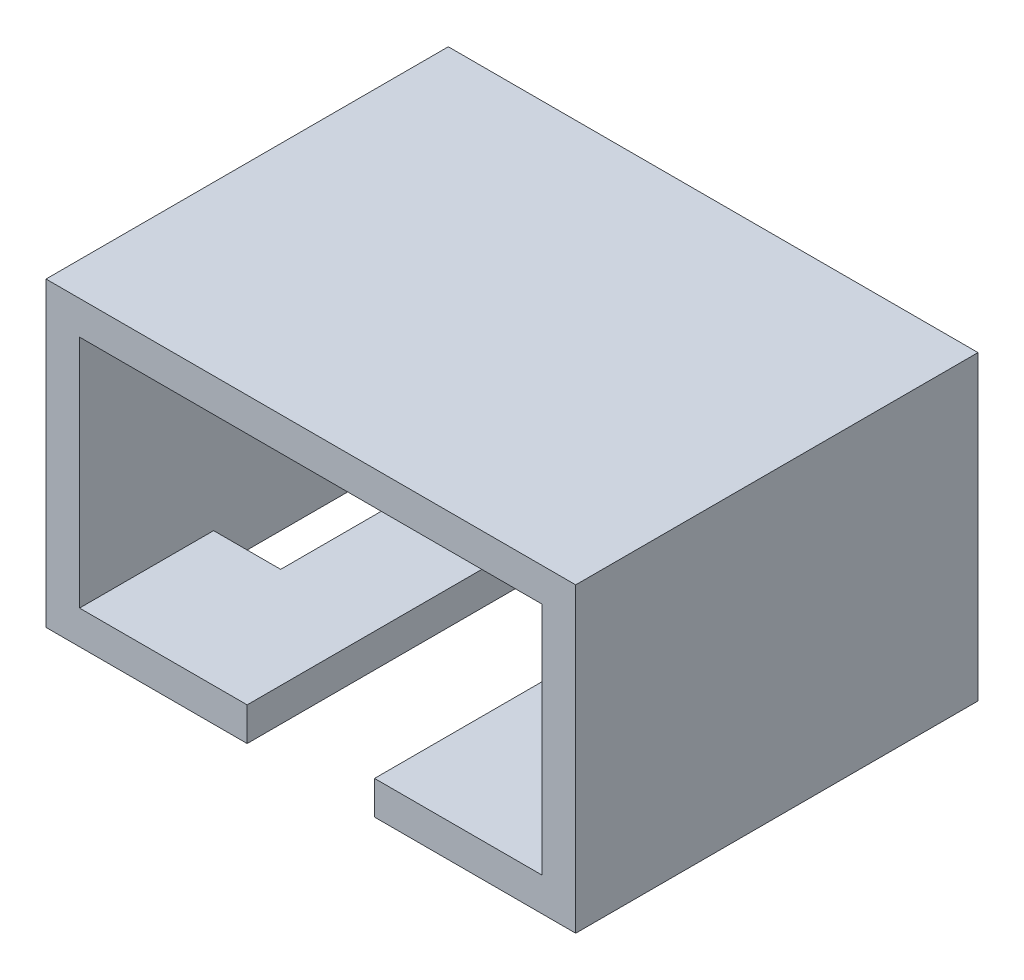
ISO-10303-21;
HEADER;
FILE_DESCRIPTION(('STEP AP214'),'2;1');
FILE_NAME('part.step','',(''),(''),'','','');
FILE_SCHEMA(('AUTOMOTIVE_DESIGN { 1 0 10303 214 1 1 1 1 }'));
ENDSEC;
DATA;
#1=APPLICATION_CONTEXT('core data for automotive mechanical design processes');
#2=APPLICATION_PROTOCOL_DEFINITION('international standard','automotive_design',2000,#1);
#3=PRODUCT_CONTEXT('',#1,'mechanical');
#4=PRODUCT('Part','Part','',(#3));
#5=PRODUCT_RELATED_PRODUCT_CATEGORY('part','',(#4));
#6=PRODUCT_DEFINITION_FORMATION('','',#4);
#7=PRODUCT_DEFINITION_CONTEXT('part definition',#1,'design');
#8=PRODUCT_DEFINITION('design','',#6,#7);
#9=PRODUCT_DEFINITION_SHAPE('','',#8);
#10=(LENGTH_UNIT() NAMED_UNIT(*) SI_UNIT(.MILLI.,.METRE.));
#11=(NAMED_UNIT(*) PLANE_ANGLE_UNIT() SI_UNIT($,.RADIAN.));
#12=(NAMED_UNIT(*) SI_UNIT($,.STERADIAN.) SOLID_ANGLE_UNIT());
#13=UNCERTAINTY_MEASURE_WITH_UNIT(LENGTH_MEASURE(1.E-05),#10,'distance_accuracy_value','');
#14=(GEOMETRIC_REPRESENTATION_CONTEXT(3) GLOBAL_UNCERTAINTY_ASSIGNED_CONTEXT((#13)) GLOBAL_UNIT_ASSIGNED_CONTEXT((#10,
#11,#12)) REPRESENTATION_CONTEXT('',''));
#15=CARTESIAN_POINT('',(0.,0.,0.));
#16=DIRECTION('',(0.,0.,1.));
#17=DIRECTION('',(1.,0.,0.));
#18=AXIS2_PLACEMENT_3D('',#15,#16,#17);
#19=CARTESIAN_POINT('',(1.75,0.,1.602));
#20=DIRECTION('',(-1.,0.,0.));
#21=DIRECTION('',(0.,-1.,0.));
#22=AXIS2_PLACEMENT_3D('',#19,#20,#21);
#23=PLANE('',#22);
#24=DIRECTION('',(0.,-1.,0.));
#25=VECTOR('',#24,1.);
#26=CARTESIAN_POINT('',(1.75,0.,0.));
#27=LINE('',#26,#25);
#28=CARTESIAN_POINT('',(1.75,0.25,0.));
#29=VERTEX_POINT('',#28);
#30=CARTESIAN_POINT('',(1.75,-0.25,0.));
#31=VERTEX_POINT('',#30);
#32=EDGE_CURVE('E228',#29,#31,#27,.T.);
#33=ORIENTED_EDGE('',*,*,#32,.F.);
#34=DIRECTION('',(0.,0.,1.));
#35=VECTOR('',#34,1.);
#36=CARTESIAN_POINT('',(1.75,0.25,1.602));
#37=LINE('',#36,#35);
#38=CARTESIAN_POINT('',(1.75,0.25,1.6));
#39=VERTEX_POINT('',#38);
#40=EDGE_CURVE('E233',#39,#29,#37,.F.);
#41=ORIENTED_EDGE('',*,*,#40,.F.);
#42=DIRECTION('',(0.,-1.,0.));
#43=VECTOR('',#42,1.);
#44=CARTESIAN_POINT('',(1.75,0.,1.6));
#45=LINE('',#44,#43);
#46=CARTESIAN_POINT('',(1.75,-0.25,1.6));
#47=VERTEX_POINT('',#46);
#48=EDGE_CURVE('E19',#47,#39,#45,.F.);
#49=ORIENTED_EDGE('',*,*,#48,.F.);
#50=DIRECTION('',(0.,0.,1.));
#51=VECTOR('',#50,1.);
#52=CARTESIAN_POINT('',(1.75,-0.25,1.602));
#53=LINE('',#52,#51);
#54=EDGE_CURVE('E236',#47,#31,#53,.F.);
#55=ORIENTED_EDGE('',*,*,#54,.T.);
#56=EDGE_LOOP('',(#33,#41,#49,#55));
#57=FACE_BOUND('',#56,.T.);
#58=ADVANCED_FACE('F16',(#57),#23,.F.);
#59=CARTESIAN_POINT('',(-0.25,0.,1.602));
#60=DIRECTION('',(-1.,0.,0.));
#61=DIRECTION('',(0.,-1.,0.));
#62=AXIS2_PLACEMENT_3D('',#59,#60,#61);
#63=PLANE('',#62);
#64=DIRECTION('',(0.,-1.,0.));
#65=VECTOR('',#64,1.);
#66=CARTESIAN_POINT('',(-0.25,0.,0.));
#67=LINE('',#66,#65);
#68=CARTESIAN_POINT('',(-0.25,0.25,0.));
#69=VERTEX_POINT('',#68);
#70=CARTESIAN_POINT('',(-0.25,-0.25,0.));
#71=VERTEX_POINT('',#70);
#72=EDGE_CURVE('E258',#69,#71,#67,.T.);
#73=ORIENTED_EDGE('',*,*,#72,.F.);
#74=DIRECTION('',(0.,0.,1.));
#75=VECTOR('',#74,1.);
#76=CARTESIAN_POINT('',(-0.25,0.25,1.602));
#77=LINE('',#76,#75);
#78=CARTESIAN_POINT('',(-0.25,0.25,1.6));
#79=VERTEX_POINT('',#78);
#80=EDGE_CURVE('E274',#79,#69,#77,.F.);
#81=ORIENTED_EDGE('',*,*,#80,.F.);
#82=DIRECTION('',(0.,-1.,0.));
#83=VECTOR('',#82,1.);
#84=CARTESIAN_POINT('',(-0.25,0.,1.6));
#85=LINE('',#84,#83);
#86=CARTESIAN_POINT('',(-0.25,-0.25,1.6));
#87=VERTEX_POINT('',#86);
#88=EDGE_CURVE('E238',#87,#79,#85,.F.);
#89=ORIENTED_EDGE('',*,*,#88,.F.);
#90=DIRECTION('',(0.,0.,1.));
#91=VECTOR('',#90,1.);
#92=CARTESIAN_POINT('',(-0.25,-0.25,1.602));
#93=LINE('',#92,#91);
#94=EDGE_CURVE('E306',#87,#71,#93,.F.);
#95=ORIENTED_EDGE('',*,*,#94,.T.);
#96=EDGE_LOOP('',(#73,#81,#89,#95));
#97=FACE_BOUND('',#96,.T.);
#98=ADVANCED_FACE('F275',(#97),#63,.F.);
#99=CARTESIAN_POINT('',(-2.25,0.,1.602));
#100=DIRECTION('',(-1.,0.,0.));
#101=DIRECTION('',(0.,-1.,0.));
#102=AXIS2_PLACEMENT_3D('',#99,#100,#101);
#103=PLANE('',#102);
#104=DIRECTION('',(0.,-1.,0.));
#105=VECTOR('',#104,1.);
#106=CARTESIAN_POINT('',(-2.25,0.,0.));
#107=LINE('',#106,#105);
#108=CARTESIAN_POINT('',(-2.25,0.25,0.));
#109=VERTEX_POINT('',#108);
#110=CARTESIAN_POINT('',(-2.25,-0.25,0.));
#111=VERTEX_POINT('',#110);
#112=EDGE_CURVE('E251',#109,#111,#107,.T.);
#113=ORIENTED_EDGE('',*,*,#112,.F.);
#114=DIRECTION('',(0.,0.,1.));
#115=VECTOR('',#114,1.);
#116=CARTESIAN_POINT('',(-2.25,0.25,1.602));
#117=LINE('',#116,#115);
#118=CARTESIAN_POINT('',(-2.25,0.25,1.6));
#119=VERTEX_POINT('',#118);
#120=EDGE_CURVE('E301',#119,#109,#117,.F.);
#121=ORIENTED_EDGE('',*,*,#120,.F.);
#122=DIRECTION('',(0.,-1.,0.));
#123=VECTOR('',#122,1.);
#124=CARTESIAN_POINT('',(-2.25,0.,1.6));
#125=LINE('',#124,#123);
#126=CARTESIAN_POINT('',(-2.25,-0.25,1.6));
#127=VERTEX_POINT('',#126);
#128=EDGE_CURVE('E253',#127,#119,#125,.F.);
#129=ORIENTED_EDGE('',*,*,#128,.F.);
#130=DIRECTION('',(0.,0.,1.));
#131=VECTOR('',#130,1.);
#132=CARTESIAN_POINT('',(-2.25,-0.25,1.602));
#133=LINE('',#132,#131);
#134=EDGE_CURVE('E296',#127,#111,#133,.F.);
#135=ORIENTED_EDGE('',*,*,#134,.T.);
#136=EDGE_LOOP('',(#113,#121,#129,#135));
#137=FACE_BOUND('',#136,.T.);
#138=ADVANCED_FACE('F647',(#137),#103,.F.);
#139=CARTESIAN_POINT('',(2.,0.25,1.602));
#140=DIRECTION('',(0.,-1.,0.));
#141=DIRECTION('',(1.,0.,0.));
#142=AXIS2_PLACEMENT_3D('',#139,#140,#141);
#143=PLANE('',#142);
#144=DIRECTION('',(1.,0.,0.));
#145=VECTOR('',#144,1.);
#146=CARTESIAN_POINT('',(2.,0.25,0.));
#147=LINE('',#146,#145);
#148=CARTESIAN_POINT('',(2.25,0.25,0.));
#149=VERTEX_POINT('',#148);
#150=EDGE_CURVE('E240',#29,#149,#147,.T.);
#151=ORIENTED_EDGE('',*,*,#150,.T.);
#152=DIRECTION('',(0.,0.,1.));
#153=VECTOR('',#152,1.);
#154=CARTESIAN_POINT('',(2.25,0.25,1.602));
#155=LINE('',#154,#153);
#156=CARTESIAN_POINT('',(2.25,0.25,1.6));
#157=VERTEX_POINT('',#156);
#158=EDGE_CURVE('E320',#157,#149,#155,.F.);
#159=ORIENTED_EDGE('',*,*,#158,.F.);
#160=DIRECTION('',(1.,0.,0.));
#161=VECTOR('',#160,1.);
#162=CARTESIAN_POINT('',(0.,0.25,1.6));
#163=LINE('',#162,#161);
#164=EDGE_CURVE('E250',#39,#157,#163,.T.);
#165=ORIENTED_EDGE('',*,*,#164,.F.);
#166=ORIENTED_EDGE('',*,*,#40,.T.);
#167=EDGE_LOOP('',(#151,#159,#165,#166));
#168=FACE_BOUND('',#167,.T.);
#169=ADVANCED_FACE('F249',(#168),#143,.T.);
#170=CARTESIAN_POINT('',(2.,-0.25,1.602));
#171=DIRECTION('',(0.,-1.,0.));
#172=DIRECTION('',(1.,0.,0.));
#173=AXIS2_PLACEMENT_3D('',#170,#171,#172);
#174=PLANE('',#173);
#175=DIRECTION('',(1.,0.,0.));
#176=VECTOR('',#175,1.);
#177=CARTESIAN_POINT('',(2.,-0.25,0.));
#178=LINE('',#177,#176);
#179=CARTESIAN_POINT('',(2.25,-0.25,0.));
#180=VERTEX_POINT('',#179);
#181=EDGE_CURVE('E279',#31,#180,#178,.T.);
#182=ORIENTED_EDGE('',*,*,#181,.F.);
#183=ORIENTED_EDGE('',*,*,#54,.F.);
#184=DIRECTION('',(1.,0.,0.));
#185=VECTOR('',#184,1.);
#186=CARTESIAN_POINT('',(0.,-0.25,1.6));
#187=LINE('',#186,#185);
#188=CARTESIAN_POINT('',(2.25,-0.25,1.6));
#189=VERTEX_POINT('',#188);
#190=EDGE_CURVE('E315',#189,#47,#187,.F.);
#191=ORIENTED_EDGE('',*,*,#190,.F.);
#192=DIRECTION('',(0.,0.,1.));
#193=VECTOR('',#192,1.);
#194=CARTESIAN_POINT('',(2.25,-0.25,1.602));
#195=LINE('',#194,#193);
#196=EDGE_CURVE('E312',#180,#189,#195,.T.);
#197=ORIENTED_EDGE('',*,*,#196,.F.);
#198=EDGE_LOOP('',(#182,#183,#191,#197));
#199=FACE_BOUND('',#198,.T.);
#200=ADVANCED_FACE('F313',(#199),#174,.F.);
#201=CARTESIAN_POINT('',(0.,0.25,1.602));
#202=DIRECTION('',(0.,-1.,0.));
#203=DIRECTION('',(1.,0.,0.));
#204=AXIS2_PLACEMENT_3D('',#201,#202,#203);
#205=PLANE('',#204);
#206=DIRECTION('',(1.,0.,0.));
#207=VECTOR('',#206,1.);
#208=CARTESIAN_POINT('',(0.,0.25,0.));
#209=LINE('',#208,#207);
#210=CARTESIAN_POINT('',(0.25,0.25,0.));
#211=VERTEX_POINT('',#210);
#212=EDGE_CURVE('E278',#69,#211,#209,.T.);
#213=ORIENTED_EDGE('',*,*,#212,.T.);
#214=DIRECTION('',(0.,0.,1.));
#215=VECTOR('',#214,1.);
#216=CARTESIAN_POINT('',(0.25,0.25,1.602));
#217=LINE('',#216,#215);
#218=CARTESIAN_POINT('',(0.25,0.25,1.6));
#219=VERTEX_POINT('',#218);
#220=EDGE_CURVE('E283',#219,#211,#217,.F.);
#221=ORIENTED_EDGE('',*,*,#220,.F.);
#222=DIRECTION('',(1.,0.,0.));
#223=VECTOR('',#222,1.);
#224=CARTESIAN_POINT('',(0.,0.25,1.6));
#225=LINE('',#224,#223);
#226=EDGE_CURVE('E267',#79,#219,#225,.T.);
#227=ORIENTED_EDGE('',*,*,#226,.F.);
#228=ORIENTED_EDGE('',*,*,#80,.T.);
#229=EDGE_LOOP('',(#213,#221,#227,#228));
#230=FACE_BOUND('',#229,.T.);
#231=ADVANCED_FACE('F281',(#230),#205,.T.);
#232=CARTESIAN_POINT('',(0.,-0.25,1.602));
#233=DIRECTION('',(0.,-1.,0.));
#234=DIRECTION('',(1.,0.,0.));
#235=AXIS2_PLACEMENT_3D('',#232,#233,#234);
#236=PLANE('',#235);
#237=DIRECTION('',(1.,0.,0.));
#238=VECTOR('',#237,1.);
#239=CARTESIAN_POINT('',(0.,-0.25,0.));
#240=LINE('',#239,#238);
#241=CARTESIAN_POINT('',(0.25,-0.25,0.));
#242=VERTEX_POINT('',#241);
#243=EDGE_CURVE('E304',#71,#242,#240,.T.);
#244=ORIENTED_EDGE('',*,*,#243,.F.);
#245=ORIENTED_EDGE('',*,*,#94,.F.);
#246=DIRECTION('',(1.,0.,0.));
#247=VECTOR('',#246,1.);
#248=CARTESIAN_POINT('',(0.,-0.25,1.6));
#249=LINE('',#248,#247);
#250=CARTESIAN_POINT('',(0.25,-0.25,1.6));
#251=VERTEX_POINT('',#250);
#252=EDGE_CURVE('E269',#251,#87,#249,.F.);
#253=ORIENTED_EDGE('',*,*,#252,.F.);
#254=DIRECTION('',(0.,0.,1.));
#255=VECTOR('',#254,1.);
#256=CARTESIAN_POINT('',(0.25,-0.25,1.602));
#257=LINE('',#256,#255);
#258=EDGE_CURVE('E434',#242,#251,#257,.T.);
#259=ORIENTED_EDGE('',*,*,#258,.F.);
#260=EDGE_LOOP('',(#244,#245,#253,#259));
#261=FACE_BOUND('',#260,.T.);
#262=ADVANCED_FACE('F660',(#261),#236,.F.);
#263=CARTESIAN_POINT('',(-2.,0.25,1.602));
#264=DIRECTION('',(0.,-1.,0.));
#265=DIRECTION('',(1.,0.,0.));
#266=AXIS2_PLACEMENT_3D('',#263,#264,#265);
#267=PLANE('',#266);
#268=DIRECTION('',(1.,0.,0.));
#269=VECTOR('',#268,1.);
#270=CARTESIAN_POINT('',(-2.,0.25,0.));
#271=LINE('',#270,#269);
#272=CARTESIAN_POINT('',(-1.75,0.25,0.));
#273=VERTEX_POINT('',#272);
#274=EDGE_CURVE('E299',#109,#273,#271,.T.);
#275=ORIENTED_EDGE('',*,*,#274,.T.);
#276=DIRECTION('',(0.,0.,1.));
#277=VECTOR('',#276,1.);
#278=CARTESIAN_POINT('',(-1.75,0.25,1.602));
#279=LINE('',#278,#277);
#280=CARTESIAN_POINT('',(-1.75,0.25,1.6));
#281=VERTEX_POINT('',#280);
#282=EDGE_CURVE('E428',#281,#273,#279,.F.);
#283=ORIENTED_EDGE('',*,*,#282,.F.);
#284=DIRECTION('',(1.,0.,0.));
#285=VECTOR('',#284,1.);
#286=CARTESIAN_POINT('',(0.,0.25,1.6));
#287=LINE('',#286,#285);
#288=EDGE_CURVE('E289',#119,#281,#287,.T.);
#289=ORIENTED_EDGE('',*,*,#288,.F.);
#290=ORIENTED_EDGE('',*,*,#120,.T.);
#291=EDGE_LOOP('',(#275,#283,#289,#290));
#292=FACE_BOUND('',#291,.T.);
#293=ADVANCED_FACE('F483',(#292),#267,.T.);
#294=CARTESIAN_POINT('',(-2.,-0.25,1.602));
#295=DIRECTION('',(0.,-1.,0.));
#296=DIRECTION('',(1.,0.,0.));
#297=AXIS2_PLACEMENT_3D('',#294,#295,#296);
#298=PLANE('',#297);
#299=DIRECTION('',(1.,0.,0.));
#300=VECTOR('',#299,1.);
#301=CARTESIAN_POINT('',(-2.,-0.25,0.));
#302=LINE('',#301,#300);
#303=CARTESIAN_POINT('',(-1.75,-0.25,0.));
#304=VERTEX_POINT('',#303);
#305=EDGE_CURVE('E294',#111,#304,#302,.T.);
#306=ORIENTED_EDGE('',*,*,#305,.F.);
#307=ORIENTED_EDGE('',*,*,#134,.F.);
#308=DIRECTION('',(1.,0.,0.));
#309=VECTOR('',#308,1.);
#310=CARTESIAN_POINT('',(0.,-0.25,1.6));
#311=LINE('',#310,#309);
#312=CARTESIAN_POINT('',(-1.75,-0.25,1.6));
#313=VERTEX_POINT('',#312);
#314=EDGE_CURVE('E285',#313,#127,#311,.F.);
#315=ORIENTED_EDGE('',*,*,#314,.F.);
#316=DIRECTION('',(0.,0.,1.));
#317=VECTOR('',#316,1.);
#318=CARTESIAN_POINT('',(-1.75,-0.25,1.602));
#319=LINE('',#318,#317);
#320=EDGE_CURVE('E425',#304,#313,#319,.T.);
#321=ORIENTED_EDGE('',*,*,#320,.F.);
#322=EDGE_LOOP('',(#306,#307,#315,#321));
#323=FACE_BOUND('',#322,.T.);
#324=ADVANCED_FACE('F472',(#323),#298,.F.);
#325=CARTESIAN_POINT('',(0.,0.55,1.6));
#326=DIRECTION('',(0.,0.,1.));
#327=DIRECTION('',(1.,0.,0.));
#328=AXIS2_PLACEMENT_3D('',#325,#326,#327);
#329=PLANE('',#328);
#330=DIRECTION('',(1.,0.,0.));
#331=VECTOR('',#330,1.);
#332=CARTESIAN_POINT('',(0.,-1.2,1.6));
#333=LINE('',#332,#331);
#334=CARTESIAN_POINT('',(2.45,-1.2,1.6));
#335=VERTEX_POINT('',#334);
#336=CARTESIAN_POINT('',(3.45,-1.2,1.6));
#337=VERTEX_POINT('',#336);
#338=EDGE_CURVE('E449',#335,#337,#333,.T.);
#339=ORIENTED_EDGE('',*,*,#338,.T.);
#340=DIRECTION('',(0.,1.,0.));
#341=VECTOR('',#340,1.);
#342=CARTESIAN_POINT('',(3.45,0.55,1.6));
#343=LINE('',#342,#341);
#344=CARTESIAN_POINT('',(3.45,2.3,1.6));
#345=VERTEX_POINT('',#344);
#346=EDGE_CURVE('E393',#345,#337,#343,.F.);
#347=ORIENTED_EDGE('',*,*,#346,.F.);
#348=DIRECTION('',(1.,0.,0.));
#349=VECTOR('',#348,1.);
#350=CARTESIAN_POINT('',(0.,2.3,1.6));
#351=LINE('',#350,#349);
#352=CARTESIAN_POINT('',(-3.45,2.3,1.6));
#353=VERTEX_POINT('',#352);
#354=EDGE_CURVE('E399',#353,#345,#351,.T.);
#355=ORIENTED_EDGE('',*,*,#354,.F.);
#356=DIRECTION('',(0.,1.,0.));
#357=VECTOR('',#356,1.);
#358=CARTESIAN_POINT('',(-3.45,0.55,1.6));
#359=LINE('',#358,#357);
#360=CARTESIAN_POINT('',(-3.45,-1.2,1.6));
#361=VERTEX_POINT('',#360);
#362=EDGE_CURVE('E411',#361,#353,#359,.T.);
#363=ORIENTED_EDGE('',*,*,#362,.F.);
#364=DIRECTION('',(1.,0.,0.));
#365=VECTOR('',#364,1.);
#366=CARTESIAN_POINT('',(0.,-1.2,1.6));
#367=LINE('',#366,#365);
#368=CARTESIAN_POINT('',(-2.45,-1.2,1.6));
#369=VERTEX_POINT('',#368);
#370=EDGE_CURVE('E445',#361,#369,#367,.T.);
#371=ORIENTED_EDGE('',*,*,#370,.T.);
#372=DIRECTION('',(1.,0.,0.));
#373=VECTOR('',#372,1.);
#374=CARTESIAN_POINT('',(0.,-1.2,1.6));
#375=LINE('',#374,#373);
#376=CARTESIAN_POINT('',(-0.95,-1.2,1.6));
#377=VERTEX_POINT('',#376);
#378=EDGE_CURVE('E417',#377,#369,#375,.F.);
#379=ORIENTED_EDGE('',*,*,#378,.F.);
#380=DIRECTION('',(0.,1.,0.));
#381=VECTOR('',#380,1.);
#382=CARTESIAN_POINT('',(-0.95,-1.198,1.6));
#383=LINE('',#382,#381);
#384=CARTESIAN_POINT('',(-0.95,-1.7,1.6));
#385=VERTEX_POINT('',#384);
#386=EDGE_CURVE('E453',#377,#385,#383,.F.);
#387=ORIENTED_EDGE('',*,*,#386,.T.);
#388=DIRECTION('',(1.,0.,0.));
#389=VECTOR('',#388,1.);
#390=CARTESIAN_POINT('',(0.,-1.7,1.6));
#391=LINE('',#390,#389);
#392=CARTESIAN_POINT('',(0.95,-1.7,1.6));
#393=VERTEX_POINT('',#392);
#394=EDGE_CURVE('E368',#385,#393,#391,.T.);
#395=ORIENTED_EDGE('',*,*,#394,.T.);
#396=DIRECTION('',(0.,1.,0.));
#397=VECTOR('',#396,1.);
#398=CARTESIAN_POINT('',(0.95,-1.198,1.6));
#399=LINE('',#398,#397);
#400=CARTESIAN_POINT('',(0.95,-1.2,1.6));
#401=VERTEX_POINT('',#400);
#402=EDGE_CURVE('E466',#401,#393,#399,.F.);
#403=ORIENTED_EDGE('',*,*,#402,.F.);
#404=DIRECTION('',(1.,0.,0.));
#405=VECTOR('',#404,1.);
#406=CARTESIAN_POINT('',(0.,-1.2,1.6));
#407=LINE('',#406,#405);
#408=EDGE_CURVE('E373',#335,#401,#407,.F.);
#409=ORIENTED_EDGE('',*,*,#408,.F.);
#410=EDGE_LOOP('',(#339,#347,#355,#363,#371,#379,#387,#395,#403,#409));
#411=FACE_BOUND('',#410,.T.);
#412=ORIENTED_EDGE('',*,*,#190,.T.);
#413=ORIENTED_EDGE('',*,*,#48,.T.);
#414=ORIENTED_EDGE('',*,*,#164,.T.);
#415=DIRECTION('',(0.,-1.,0.));
#416=VECTOR('',#415,1.);
#417=CARTESIAN_POINT('',(2.25,0.,1.6));
#418=LINE('',#417,#416);
#419=EDGE_CURVE('E440',#189,#157,#418,.F.);
#420=ORIENTED_EDGE('',*,*,#419,.F.);
#421=EDGE_LOOP('',(#412,#413,#414,#420));
#422=FACE_BOUND('',#421,.T.);
#423=ORIENTED_EDGE('',*,*,#252,.T.);
#424=ORIENTED_EDGE('',*,*,#88,.T.);
#425=ORIENTED_EDGE('',*,*,#226,.T.);
#426=DIRECTION('',(0.,-1.,0.));
#427=VECTOR('',#426,1.);
#428=CARTESIAN_POINT('',(0.25,0.,1.6));
#429=LINE('',#428,#427);
#430=EDGE_CURVE('E319',#251,#219,#429,.F.);
#431=ORIENTED_EDGE('',*,*,#430,.F.);
#432=EDGE_LOOP('',(#423,#424,#425,#431));
#433=FACE_BOUND('',#432,.T.);
#434=ORIENTED_EDGE('',*,*,#314,.T.);
#435=ORIENTED_EDGE('',*,*,#128,.T.);
#436=ORIENTED_EDGE('',*,*,#288,.T.);
#437=DIRECTION('',(0.,-1.,0.));
#438=VECTOR('',#437,1.);
#439=CARTESIAN_POINT('',(-1.75,0.,1.6));
#440=LINE('',#439,#438);
#441=EDGE_CURVE('E431',#313,#281,#440,.F.);
#442=ORIENTED_EDGE('',*,*,#441,.F.);
#443=EDGE_LOOP('',(#434,#435,#436,#442));
#444=FACE_BOUND('',#443,.T.);
#445=ADVANCED_FACE('F263',(#411,#422,#433,#444),#329,.T.);
#446=CARTESIAN_POINT('',(0.95,-1.198,3.8));
#447=DIRECTION('',(-1.,0.,0.));
#448=DIRECTION('',(0.,0.,1.));
#449=AXIS2_PLACEMENT_3D('',#446,#447,#448);
#450=PLANE('',#449);
#451=DIRECTION('',(0.,0.,1.));
#452=VECTOR('',#451,1.);
#453=CARTESIAN_POINT('',(0.95,-1.7,1.6));
#454=LINE('',#453,#452);
#455=CARTESIAN_POINT('',(0.95,-1.7,6.));
#456=VERTEX_POINT('',#455);
#457=EDGE_CURVE('E365',#393,#456,#454,.T.);
#458=ORIENTED_EDGE('',*,*,#457,.T.);
#459=DIRECTION('',(0.,1.,0.));
#460=VECTOR('',#459,1.);
#461=CARTESIAN_POINT('',(0.95,-1.198,6.));
#462=LINE('',#461,#460);
#463=CARTESIAN_POINT('',(0.95,-1.2,6.));
#464=VERTEX_POINT('',#463);
#465=EDGE_CURVE('E464',#456,#464,#462,.T.);
#466=ORIENTED_EDGE('',*,*,#465,.T.);
#467=DIRECTION('',(0.,0.,1.));
#468=VECTOR('',#467,1.);
#469=CARTESIAN_POINT('',(0.95,-1.2,6.));
#470=LINE('',#469,#468);
#471=EDGE_CURVE('E370',#401,#464,#470,.T.);
#472=ORIENTED_EDGE('',*,*,#471,.F.);
#473=ORIENTED_EDGE('',*,*,#402,.T.);
#474=EDGE_LOOP('',(#458,#466,#472,#473));
#475=FACE_BOUND('',#474,.T.);
#476=ADVANCED_FACE('F471',(#475),#450,.T.);
#477=CARTESIAN_POINT('',(2.95,-1.198,4.));
#478=DIRECTION('',(0.,0.,1.));
#479=DIRECTION('',(1.,0.,0.));
#480=AXIS2_PLACEMENT_3D('',#477,#478,#479);
#481=PLANE('',#480);
#482=DIRECTION('',(1.,0.,0.));
#483=VECTOR('',#482,1.);
#484=CARTESIAN_POINT('',(0.,-1.7,4.));
#485=LINE('',#484,#483);
#486=CARTESIAN_POINT('',(3.45,-1.7,4.));
#487=VERTEX_POINT('',#486);
#488=CARTESIAN_POINT('',(2.45,-1.7,4.));
#489=VERTEX_POINT('',#488);
#490=EDGE_CURVE('E360',#487,#489,#485,.F.);
#491=ORIENTED_EDGE('',*,*,#490,.T.);
#492=DIRECTION('',(0.,1.,0.));
#493=VECTOR('',#492,1.);
#494=CARTESIAN_POINT('',(2.45,-1.198,4.));
#495=LINE('',#494,#493);
#496=CARTESIAN_POINT('',(2.45,-1.2,4.));
#497=VERTEX_POINT('',#496);
#498=EDGE_CURVE('E460',#489,#497,#495,.T.);
#499=ORIENTED_EDGE('',*,*,#498,.T.);
#500=DIRECTION('',(1.,0.,0.));
#501=VECTOR('',#500,1.);
#502=CARTESIAN_POINT('',(0.,-1.2,4.));
#503=LINE('',#502,#501);
#504=CARTESIAN_POINT('',(3.45,-1.2,4.));
#505=VERTEX_POINT('',#504);
#506=EDGE_CURVE('E379',#505,#497,#503,.F.);
#507=ORIENTED_EDGE('',*,*,#506,.F.);
#508=DIRECTION('',(0.,1.,0.));
#509=VECTOR('',#508,1.);
#510=CARTESIAN_POINT('',(3.45,0.55,4.));
#511=LINE('',#510,#509);
#512=EDGE_CURVE('E388',#487,#505,#511,.T.);
#513=ORIENTED_EDGE('',*,*,#512,.F.);
#514=EDGE_LOOP('',(#491,#499,#507,#513));
#515=FACE_BOUND('',#514,.T.);
#516=ADVANCED_FACE('F480',(#515),#481,.F.);
#517=CARTESIAN_POINT('',(2.45,-1.198,2.));
#518=DIRECTION('',(-1.,0.,0.));
#519=DIRECTION('',(0.,0.,1.));
#520=AXIS2_PLACEMENT_3D('',#517,#518,#519);
#521=PLANE('',#520);
#522=DIRECTION('',(0.,0.,1.));
#523=VECTOR('',#522,1.);
#524=CARTESIAN_POINT('',(2.45,-1.7,1.6));
#525=LINE('',#524,#523);
#526=CARTESIAN_POINT('',(2.45,-1.7,0.));
#527=VERTEX_POINT('',#526);
#528=EDGE_CURVE('E357',#489,#527,#525,.F.);
#529=ORIENTED_EDGE('',*,*,#528,.T.);
#530=DIRECTION('',(0.,1.,0.));
#531=VECTOR('',#530,1.);
#532=CARTESIAN_POINT('',(2.45,-1.198,0.));
#533=LINE('',#532,#531);
#534=CARTESIAN_POINT('',(2.45,-1.2,0.));
#535=VERTEX_POINT('',#534);
#536=EDGE_CURVE('E462',#535,#527,#533,.F.);
#537=ORIENTED_EDGE('',*,*,#536,.F.);
#538=DIRECTION('',(0.,0.,1.));
#539=VECTOR('',#538,1.);
#540=CARTESIAN_POINT('',(2.45,-1.2,6.));
#541=LINE('',#540,#539);
#542=EDGE_CURVE('E447',#535,#335,#541,.T.);
#543=ORIENTED_EDGE('',*,*,#542,.T.);
#544=DIRECTION('',(0.,0.,1.));
#545=VECTOR('',#544,1.);
#546=CARTESIAN_POINT('',(2.45,-1.2,6.));
#547=LINE('',#546,#545);
#548=EDGE_CURVE('E376',#497,#335,#547,.F.);
#549=ORIENTED_EDGE('',*,*,#548,.F.);
#550=ORIENTED_EDGE('',*,*,#498,.F.);
#551=EDGE_LOOP('',(#529,#537,#543,#549,#550));
#552=FACE_BOUND('',#551,.T.);
#553=ADVANCED_FACE('F561',(#552),#521,.F.);
#554=CARTESIAN_POINT('',(-2.45,-1.198,2.));
#555=DIRECTION('',(-1.,0.,0.));
#556=DIRECTION('',(0.,0.,1.));
#557=AXIS2_PLACEMENT_3D('',#554,#555,#556);
#558=PLANE('',#557);
#559=DIRECTION('',(0.,0.,1.));
#560=VECTOR('',#559,1.);
#561=CARTESIAN_POINT('',(-2.45,-1.7,1.6));
#562=LINE('',#561,#560);
#563=CARTESIAN_POINT('',(-2.45,-1.7,0.));
#564=VERTEX_POINT('',#563);
#565=CARTESIAN_POINT('',(-2.45,-1.7,4.));
#566=VERTEX_POINT('',#565);
#567=EDGE_CURVE('E355',#564,#566,#562,.T.);
#568=ORIENTED_EDGE('',*,*,#567,.T.);
#569=DIRECTION('',(0.,1.,0.));
#570=VECTOR('',#569,1.);
#571=CARTESIAN_POINT('',(-2.45,-1.198,4.));
#572=LINE('',#571,#570);
#573=CARTESIAN_POINT('',(-2.45,-1.2,4.));
#574=VERTEX_POINT('',#573);
#575=EDGE_CURVE('E455',#574,#566,#572,.F.);
#576=ORIENTED_EDGE('',*,*,#575,.F.);
#577=DIRECTION('',(0.,0.,1.));
#578=VECTOR('',#577,1.);
#579=CARTESIAN_POINT('',(-2.45,-1.2,6.));
#580=LINE('',#579,#578);
#581=EDGE_CURVE('E414',#369,#574,#580,.T.);
#582=ORIENTED_EDGE('',*,*,#581,.F.);
#583=DIRECTION('',(0.,0.,1.));
#584=VECTOR('',#583,1.);
#585=CARTESIAN_POINT('',(-2.45,-1.2,6.));
#586=LINE('',#585,#584);
#587=CARTESIAN_POINT('',(-2.45,-1.2,0.));
#588=VERTEX_POINT('',#587);
#589=EDGE_CURVE('E442',#369,#588,#586,.F.);
#590=ORIENTED_EDGE('',*,*,#589,.T.);
#591=DIRECTION('',(0.,1.,0.));
#592=VECTOR('',#591,1.);
#593=CARTESIAN_POINT('',(-2.45,-1.198,0.));
#594=LINE('',#593,#592);
#595=EDGE_CURVE('E458',#588,#564,#594,.F.);
#596=ORIENTED_EDGE('',*,*,#595,.T.);
#597=EDGE_LOOP('',(#568,#576,#582,#590,#596));
#598=FACE_BOUND('',#597,.T.);
#599=ADVANCED_FACE('F557',(#598),#558,.T.);
#600=CARTESIAN_POINT('',(-2.95,-1.198,4.));
#601=DIRECTION('',(0.,0.,-1.));
#602=DIRECTION('',(-1.,0.,0.));
#603=AXIS2_PLACEMENT_3D('',#600,#601,#602);
#604=PLANE('',#603);
#605=DIRECTION('',(1.,0.,0.));
#606=VECTOR('',#605,1.);
#607=CARTESIAN_POINT('',(0.,-1.7,4.));
#608=LINE('',#607,#606);
#609=CARTESIAN_POINT('',(-3.45,-1.7,4.));
#610=VERTEX_POINT('',#609);
#611=EDGE_CURVE('E353',#566,#610,#608,.F.);
#612=ORIENTED_EDGE('',*,*,#611,.T.);
#613=DIRECTION('',(0.,1.,0.));
#614=VECTOR('',#613,1.);
#615=CARTESIAN_POINT('',(-3.45,0.55,4.));
#616=LINE('',#615,#614);
#617=CARTESIAN_POINT('',(-3.45,-1.2,4.));
#618=VERTEX_POINT('',#617);
#619=EDGE_CURVE('E405',#618,#610,#616,.F.);
#620=ORIENTED_EDGE('',*,*,#619,.F.);
#621=DIRECTION('',(1.,0.,0.));
#622=VECTOR('',#621,1.);
#623=CARTESIAN_POINT('',(0.,-1.2,4.));
#624=LINE('',#623,#622);
#625=EDGE_CURVE('E423',#574,#618,#624,.F.);
#626=ORIENTED_EDGE('',*,*,#625,.F.);
#627=ORIENTED_EDGE('',*,*,#575,.T.);
#628=EDGE_LOOP('',(#612,#620,#626,#627));
#629=FACE_BOUND('',#628,.T.);
#630=ADVANCED_FACE('F553',(#629),#604,.T.);
#631=CARTESIAN_POINT('',(-0.95,-1.198,3.8));
#632=DIRECTION('',(-1.,0.,0.));
#633=DIRECTION('',(0.,0.,1.));
#634=AXIS2_PLACEMENT_3D('',#631,#632,#633);
#635=PLANE('',#634);
#636=DIRECTION('',(0.,0.,1.));
#637=VECTOR('',#636,1.);
#638=CARTESIAN_POINT('',(-0.95,-1.7,1.6));
#639=LINE('',#638,#637);
#640=CARTESIAN_POINT('',(-0.95,-1.7,6.));
#641=VERTEX_POINT('',#640);
#642=EDGE_CURVE('E348',#641,#385,#639,.F.);
#643=ORIENTED_EDGE('',*,*,#642,.T.);
#644=ORIENTED_EDGE('',*,*,#386,.F.);
#645=DIRECTION('',(0.,0.,1.));
#646=VECTOR('',#645,1.);
#647=CARTESIAN_POINT('',(-0.95,-1.2,6.));
#648=LINE('',#647,#646);
#649=CARTESIAN_POINT('',(-0.95,-1.2,6.));
#650=VERTEX_POINT('',#649);
#651=EDGE_CURVE('E420',#650,#377,#648,.F.);
#652=ORIENTED_EDGE('',*,*,#651,.F.);
#653=DIRECTION('',(0.,1.,0.));
#654=VECTOR('',#653,1.);
#655=CARTESIAN_POINT('',(-0.95,-1.198,6.));
#656=LINE('',#655,#654);
#657=EDGE_CURVE('E451',#641,#650,#656,.T.);
#658=ORIENTED_EDGE('',*,*,#657,.F.);
#659=EDGE_LOOP('',(#643,#644,#652,#658));
#660=FACE_BOUND('',#659,.T.);
#661=ADVANCED_FACE('F549',(#660),#635,.F.);
#662=CARTESIAN_POINT('',(0.,-1.2,6.));
#663=DIRECTION('',(0.,1.,0.));
#664=DIRECTION('',(0.,0.,1.));
#665=AXIS2_PLACEMENT_3D('',#662,#663,#664);
#666=PLANE('',#665);
#667=DIRECTION('',(1.,0.,0.));
#668=VECTOR('',#667,1.);
#669=CARTESIAN_POINT('',(0.,-1.2,0.));
#670=LINE('',#669,#668);
#671=CARTESIAN_POINT('',(3.45,-1.2,0.));
#672=VERTEX_POINT('',#671);
#673=EDGE_CURVE('E343',#535,#672,#670,.T.);
#674=ORIENTED_EDGE('',*,*,#673,.T.);
#675=DIRECTION('',(0.,0.,1.));
#676=VECTOR('',#675,1.);
#677=CARTESIAN_POINT('',(3.45,-1.2,6.));
#678=LINE('',#677,#676);
#679=EDGE_CURVE('E390',#337,#672,#678,.F.);
#680=ORIENTED_EDGE('',*,*,#679,.F.);
#681=ORIENTED_EDGE('',*,*,#338,.F.);
#682=ORIENTED_EDGE('',*,*,#542,.F.);
#683=EDGE_LOOP('',(#674,#680,#681,#682));
#684=FACE_BOUND('',#683,.T.);
#685=ADVANCED_FACE('F545',(#684),#666,.F.);
#686=CARTESIAN_POINT('',(0.,-1.2,6.));
#687=DIRECTION('',(0.,1.,0.));
#688=DIRECTION('',(0.,0.,1.));
#689=AXIS2_PLACEMENT_3D('',#686,#687,#688);
#690=PLANE('',#689);
#691=DIRECTION('',(1.,0.,0.));
#692=VECTOR('',#691,1.);
#693=CARTESIAN_POINT('',(0.,-1.2,0.));
#694=LINE('',#693,#692);
#695=CARTESIAN_POINT('',(-3.45,-1.2,0.));
#696=VERTEX_POINT('',#695);
#697=EDGE_CURVE('E324',#696,#588,#694,.T.);
#698=ORIENTED_EDGE('',*,*,#697,.T.);
#699=ORIENTED_EDGE('',*,*,#589,.F.);
#700=ORIENTED_EDGE('',*,*,#370,.F.);
#701=DIRECTION('',(0.,0.,-1.));
#702=VECTOR('',#701,1.);
#703=CARTESIAN_POINT('',(-3.45,-1.2,6.));
#704=LINE('',#703,#702);
#705=EDGE_CURVE('E402',#696,#361,#704,.F.);
#706=ORIENTED_EDGE('',*,*,#705,.F.);
#707=EDGE_LOOP('',(#698,#699,#700,#706));
#708=FACE_BOUND('',#707,.T.);
#709=ADVANCED_FACE('F542',(#708),#690,.F.);
#710=CARTESIAN_POINT('',(2.25,0.,1.602));
#711=DIRECTION('',(-1.,0.,0.));
#712=DIRECTION('',(0.,-1.,0.));
#713=AXIS2_PLACEMENT_3D('',#710,#711,#712);
#714=PLANE('',#713);
#715=DIRECTION('',(0.,1.,0.));
#716=VECTOR('',#715,1.);
#717=CARTESIAN_POINT('',(2.25,0.55,0.));
#718=LINE('',#717,#716);
#719=EDGE_CURVE('E244',#149,#180,#718,.F.);
#720=ORIENTED_EDGE('',*,*,#719,.T.);
#721=ORIENTED_EDGE('',*,*,#196,.T.);
#722=ORIENTED_EDGE('',*,*,#419,.T.);
#723=ORIENTED_EDGE('',*,*,#158,.T.);
#724=EDGE_LOOP('',(#720,#721,#722,#723));
#725=FACE_BOUND('',#724,.T.);
#726=ADVANCED_FACE('F322',(#725),#714,.T.);
#727=CARTESIAN_POINT('',(0.25,0.,1.602));
#728=DIRECTION('',(-1.,0.,0.));
#729=DIRECTION('',(0.,-1.,0.));
#730=AXIS2_PLACEMENT_3D('',#727,#728,#729);
#731=PLANE('',#730);
#732=DIRECTION('',(0.,1.,0.));
#733=VECTOR('',#732,1.);
#734=CARTESIAN_POINT('',(0.25,0.55,0.));
#735=LINE('',#734,#733);
#736=EDGE_CURVE('E323',#211,#242,#735,.F.);
#737=ORIENTED_EDGE('',*,*,#736,.T.);
#738=ORIENTED_EDGE('',*,*,#258,.T.);
#739=ORIENTED_EDGE('',*,*,#430,.T.);
#740=ORIENTED_EDGE('',*,*,#220,.T.);
#741=EDGE_LOOP('',(#737,#738,#739,#740));
#742=FACE_BOUND('',#741,.T.);
#743=ADVANCED_FACE('F535',(#742),#731,.T.);
#744=CARTESIAN_POINT('',(-1.75,0.,1.602));
#745=DIRECTION('',(-1.,0.,0.));
#746=DIRECTION('',(0.,-1.,0.));
#747=AXIS2_PLACEMENT_3D('',#744,#745,#746);
#748=PLANE('',#747);
#749=DIRECTION('',(0.,1.,0.));
#750=VECTOR('',#749,1.);
#751=CARTESIAN_POINT('',(-1.75,0.55,0.));
#752=LINE('',#751,#750);
#753=EDGE_CURVE('E327',#273,#304,#752,.F.);
#754=ORIENTED_EDGE('',*,*,#753,.T.);
#755=ORIENTED_EDGE('',*,*,#320,.T.);
#756=ORIENTED_EDGE('',*,*,#441,.T.);
#757=ORIENTED_EDGE('',*,*,#282,.T.);
#758=EDGE_LOOP('',(#754,#755,#756,#757));
#759=FACE_BOUND('',#758,.T.);
#760=ADVANCED_FACE('F531',(#759),#748,.T.);
#761=CARTESIAN_POINT('',(0.,-1.2,6.));
#762=DIRECTION('',(0.,1.,0.));
#763=DIRECTION('',(0.,0.,1.));
#764=AXIS2_PLACEMENT_3D('',#761,#762,#763);
#765=PLANE('',#764);
#766=ORIENTED_EDGE('',*,*,#378,.T.);
#767=ORIENTED_EDGE('',*,*,#581,.T.);
#768=ORIENTED_EDGE('',*,*,#625,.T.);
#769=DIRECTION('',(0.,0.,-1.));
#770=VECTOR('',#769,1.);
#771=CARTESIAN_POINT('',(-3.45,-1.2,6.));
#772=LINE('',#771,#770);
#773=CARTESIAN_POINT('',(-3.45,-1.2,6.));
#774=VERTEX_POINT('',#773);
#775=EDGE_CURVE('E408',#774,#618,#772,.T.);
#776=ORIENTED_EDGE('',*,*,#775,.F.);
#777=DIRECTION('',(1.,0.,0.));
#778=VECTOR('',#777,1.);
#779=CARTESIAN_POINT('',(0.,-1.2,6.));
#780=LINE('',#779,#778);
#781=EDGE_CURVE('E628',#650,#774,#780,.F.);
#782=ORIENTED_EDGE('',*,*,#781,.F.);
#783=ORIENTED_EDGE('',*,*,#651,.T.);
#784=EDGE_LOOP('',(#766,#767,#768,#776,#782,#783));
#785=FACE_BOUND('',#784,.T.);
#786=ADVANCED_FACE('F527',(#785),#765,.T.);
#787=CARTESIAN_POINT('',(-3.45,0.55,6.));
#788=DIRECTION('',(1.,0.,0.));
#789=DIRECTION('',(0.,0.,-1.));
#790=AXIS2_PLACEMENT_3D('',#787,#788,#789);
#791=PLANE('',#790);
#792=DIRECTION('',(0.,1.,0.));
#793=VECTOR('',#792,1.);
#794=CARTESIAN_POINT('',(-3.45,0.55,0.));
#795=LINE('',#794,#793);
#796=CARTESIAN_POINT('',(-3.45,-1.7,0.));
#797=VERTEX_POINT('',#796);
#798=EDGE_CURVE('E330',#797,#696,#795,.T.);
#799=ORIENTED_EDGE('',*,*,#798,.T.);
#800=ORIENTED_EDGE('',*,*,#705,.T.);
#801=ORIENTED_EDGE('',*,*,#362,.T.);
#802=DIRECTION('',(0.,0.,-1.));
#803=VECTOR('',#802,1.);
#804=CARTESIAN_POINT('',(-3.45,2.3,6.));
#805=LINE('',#804,#803);
#806=CARTESIAN_POINT('',(-3.45,2.3,6.));
#807=VERTEX_POINT('',#806);
#808=EDGE_CURVE('E396',#807,#353,#805,.T.);
#809=ORIENTED_EDGE('',*,*,#808,.F.);
#810=DIRECTION('',(0.,1.,0.));
#811=VECTOR('',#810,1.);
#812=CARTESIAN_POINT('',(-3.45,0.55,6.));
#813=LINE('',#812,#811);
#814=EDGE_CURVE('E625',#774,#807,#813,.T.);
#815=ORIENTED_EDGE('',*,*,#814,.F.);
#816=ORIENTED_EDGE('',*,*,#775,.T.);
#817=ORIENTED_EDGE('',*,*,#619,.T.);
#818=DIRECTION('',(0.,0.,1.));
#819=VECTOR('',#818,1.);
#820=CARTESIAN_POINT('',(-3.45,-1.7,1.6));
#821=LINE('',#820,#819);
#822=EDGE_CURVE('E351',#610,#797,#821,.F.);
#823=ORIENTED_EDGE('',*,*,#822,.T.);
#824=EDGE_LOOP('',(#799,#800,#801,#809,#815,#816,#817,#823));
#825=FACE_BOUND('',#824,.T.);
#826=ADVANCED_FACE('F523',(#825),#791,.T.);
#827=CARTESIAN_POINT('',(0.,2.3,6.));
#828=DIRECTION('',(0.,-1.,0.));
#829=DIRECTION('',(0.,0.,-1.));
#830=AXIS2_PLACEMENT_3D('',#827,#828,#829);
#831=PLANE('',#830);
#832=DIRECTION('',(1.,0.,0.));
#833=VECTOR('',#832,1.);
#834=CARTESIAN_POINT('',(0.,2.3,6.));
#835=LINE('',#834,#833);
#836=CARTESIAN_POINT('',(3.45,2.3,6.));
#837=VERTEX_POINT('',#836);
#838=EDGE_CURVE('E623',#807,#837,#835,.T.);
#839=ORIENTED_EDGE('',*,*,#838,.F.);
#840=ORIENTED_EDGE('',*,*,#808,.T.);
#841=ORIENTED_EDGE('',*,*,#354,.T.);
#842=DIRECTION('',(0.,0.,1.));
#843=VECTOR('',#842,1.);
#844=CARTESIAN_POINT('',(3.45,2.3,6.));
#845=LINE('',#844,#843);
#846=EDGE_CURVE('E385',#837,#345,#845,.F.);
#847=ORIENTED_EDGE('',*,*,#846,.F.);
#848=EDGE_LOOP('',(#839,#840,#841,#847));
#849=FACE_BOUND('',#848,.T.);
#850=ADVANCED_FACE('F519',(#849),#831,.T.);
#851=CARTESIAN_POINT('',(3.45,0.55,6.));
#852=DIRECTION('',(-1.,0.,0.));
#853=DIRECTION('',(0.,0.,1.));
#854=AXIS2_PLACEMENT_3D('',#851,#852,#853);
#855=PLANE('',#854);
#856=DIRECTION('',(0.,1.,0.));
#857=VECTOR('',#856,1.);
#858=CARTESIAN_POINT('',(3.45,0.55,6.));
#859=LINE('',#858,#857);
#860=CARTESIAN_POINT('',(3.45,-1.2,6.));
#861=VERTEX_POINT('',#860);
#862=EDGE_CURVE('E594',#837,#861,#859,.F.);
#863=ORIENTED_EDGE('',*,*,#862,.F.);
#864=ORIENTED_EDGE('',*,*,#846,.T.);
#865=ORIENTED_EDGE('',*,*,#346,.T.);
#866=ORIENTED_EDGE('',*,*,#679,.T.);
#867=DIRECTION('',(0.,1.,0.));
#868=VECTOR('',#867,1.);
#869=CARTESIAN_POINT('',(3.45,0.55,0.));
#870=LINE('',#869,#868);
#871=CARTESIAN_POINT('',(3.45,-1.7,0.));
#872=VERTEX_POINT('',#871);
#873=EDGE_CURVE('E341',#672,#872,#870,.F.);
#874=ORIENTED_EDGE('',*,*,#873,.T.);
#875=DIRECTION('',(0.,0.,1.));
#876=VECTOR('',#875,1.);
#877=CARTESIAN_POINT('',(3.45,-1.7,1.6));
#878=LINE('',#877,#876);
#879=EDGE_CURVE('E362',#872,#487,#878,.T.);
#880=ORIENTED_EDGE('',*,*,#879,.T.);
#881=ORIENTED_EDGE('',*,*,#512,.T.);
#882=DIRECTION('',(0.,0.,1.));
#883=VECTOR('',#882,1.);
#884=CARTESIAN_POINT('',(3.45,-1.2,6.));
#885=LINE('',#884,#883);
#886=EDGE_CURVE('E382',#861,#505,#885,.F.);
#887=ORIENTED_EDGE('',*,*,#886,.F.);
#888=EDGE_LOOP('',(#863,#864,#865,#866,#874,#880,#881,#887));
#889=FACE_BOUND('',#888,.T.);
#890=ADVANCED_FACE('F515',(#889),#855,.T.);
#891=CARTESIAN_POINT('',(0.,-1.2,6.));
#892=DIRECTION('',(0.,1.,0.));
#893=DIRECTION('',(0.,0.,1.));
#894=AXIS2_PLACEMENT_3D('',#891,#892,#893);
#895=PLANE('',#894);
#896=ORIENTED_EDGE('',*,*,#471,.T.);
#897=DIRECTION('',(1.,0.,0.));
#898=VECTOR('',#897,1.);
#899=CARTESIAN_POINT('',(0.,-1.2,6.));
#900=LINE('',#899,#898);
#901=EDGE_CURVE('E591',#861,#464,#900,.F.);
#902=ORIENTED_EDGE('',*,*,#901,.F.);
#903=ORIENTED_EDGE('',*,*,#886,.T.);
#904=ORIENTED_EDGE('',*,*,#506,.T.);
#905=ORIENTED_EDGE('',*,*,#548,.T.);
#906=ORIENTED_EDGE('',*,*,#408,.T.);
#907=EDGE_LOOP('',(#896,#902,#903,#904,#905,#906));
#908=FACE_BOUND('',#907,.T.);
#909=ADVANCED_FACE('F511',(#908),#895,.T.);
#910=CARTESIAN_POINT('',(0.,-1.7,1.6));
#911=DIRECTION('',(0.,1.,0.));
#912=DIRECTION('',(0.,0.,1.));
#913=AXIS2_PLACEMENT_3D('',#910,#911,#912);
#914=PLANE('',#913);
#915=DIRECTION('',(1.,0.,0.));
#916=VECTOR('',#915,1.);
#917=CARTESIAN_POINT('',(0.,-1.7,6.));
#918=LINE('',#917,#916);
#919=CARTESIAN_POINT('',(-3.95,-1.7,6.));
#920=VERTEX_POINT('',#919);
#921=EDGE_CURVE('E604',#920,#641,#918,.T.);
#922=ORIENTED_EDGE('',*,*,#921,.F.);
#923=DIRECTION('',(0.,0.,-1.));
#924=VECTOR('',#923,1.);
#925=CARTESIAN_POINT('',(-3.95,-1.7,1.6));
#926=LINE('',#925,#924);
#927=CARTESIAN_POINT('',(-3.95,-1.7,0.));
#928=VERTEX_POINT('',#927);
#929=EDGE_CURVE('E633',#920,#928,#926,.T.);
#930=ORIENTED_EDGE('',*,*,#929,.T.);
#931=DIRECTION('',(1.,0.,0.));
#932=VECTOR('',#931,1.);
#933=CARTESIAN_POINT('',(0.,-1.7,0.));
#934=LINE('',#933,#932);
#935=EDGE_CURVE('E336',#928,#797,#934,.T.);
#936=ORIENTED_EDGE('',*,*,#935,.T.);
#937=ORIENTED_EDGE('',*,*,#822,.F.);
#938=ORIENTED_EDGE('',*,*,#611,.F.);
#939=ORIENTED_EDGE('',*,*,#567,.F.);
#940=DIRECTION('',(1.,0.,0.));
#941=VECTOR('',#940,1.);
#942=CARTESIAN_POINT('',(0.,-1.7,0.));
#943=LINE('',#942,#941);
#944=EDGE_CURVE('E345',#564,#527,#943,.T.);
#945=ORIENTED_EDGE('',*,*,#944,.T.);
#946=ORIENTED_EDGE('',*,*,#528,.F.);
#947=ORIENTED_EDGE('',*,*,#490,.F.);
#948=ORIENTED_EDGE('',*,*,#879,.F.);
#949=DIRECTION('',(1.,0.,0.));
#950=VECTOR('',#949,1.);
#951=CARTESIAN_POINT('',(0.,-1.7,0.));
#952=LINE('',#951,#950);
#953=CARTESIAN_POINT('',(3.95,-1.7,0.));
#954=VERTEX_POINT('',#953);
#955=EDGE_CURVE('E339',#872,#954,#952,.T.);
#956=ORIENTED_EDGE('',*,*,#955,.T.);
#957=DIRECTION('',(0.,0.,-1.));
#958=VECTOR('',#957,1.);
#959=CARTESIAN_POINT('',(3.95,-1.7,1.6));
#960=LINE('',#959,#958);
#961=CARTESIAN_POINT('',(3.95,-1.7,6.));
#962=VERTEX_POINT('',#961);
#963=EDGE_CURVE('E606',#962,#954,#960,.T.);
#964=ORIENTED_EDGE('',*,*,#963,.F.);
#965=DIRECTION('',(1.,0.,0.));
#966=VECTOR('',#965,1.);
#967=CARTESIAN_POINT('',(0.,-1.7,6.));
#968=LINE('',#967,#966);
#969=EDGE_CURVE('E619',#456,#962,#968,.T.);
#970=ORIENTED_EDGE('',*,*,#969,.F.);
#971=ORIENTED_EDGE('',*,*,#457,.F.);
#972=ORIENTED_EDGE('',*,*,#394,.F.);
#973=ORIENTED_EDGE('',*,*,#642,.F.);
#974=EDGE_LOOP('',(#922,#930,#936,#937,#938,#939,#945,#946,#947,#948,#956,#964,#970,#971,#972,#973));
#975=FACE_BOUND('',#974,.T.);
#976=ADVANCED_FACE('F507',(#975),#914,.F.);
#977=CARTESIAN_POINT('',(0.,0.55,0.));
#978=DIRECTION('',(0.,0.,1.));
#979=DIRECTION('',(1.,0.,0.));
#980=AXIS2_PLACEMENT_3D('',#977,#978,#979);
#981=PLANE('',#980);
#982=ORIENTED_EDGE('',*,*,#274,.F.);
#983=ORIENTED_EDGE('',*,*,#112,.T.);
#984=ORIENTED_EDGE('',*,*,#305,.T.);
#985=ORIENTED_EDGE('',*,*,#753,.F.);
#986=EDGE_LOOP('',(#982,#983,#984,#985));
#987=FACE_BOUND('',#986,.T.);
#988=ORIENTED_EDGE('',*,*,#212,.F.);
#989=ORIENTED_EDGE('',*,*,#72,.T.);
#990=ORIENTED_EDGE('',*,*,#243,.T.);
#991=ORIENTED_EDGE('',*,*,#736,.F.);
#992=EDGE_LOOP('',(#988,#989,#990,#991));
#993=FACE_BOUND('',#992,.T.);
#994=ORIENTED_EDGE('',*,*,#150,.F.);
#995=ORIENTED_EDGE('',*,*,#32,.T.);
#996=ORIENTED_EDGE('',*,*,#181,.T.);
#997=ORIENTED_EDGE('',*,*,#719,.F.);
#998=EDGE_LOOP('',(#994,#995,#996,#997));
#999=FACE_BOUND('',#998,.T.);
#1000=ORIENTED_EDGE('',*,*,#798,.F.);
#1001=ORIENTED_EDGE('',*,*,#935,.F.);
#1002=DIRECTION('',(0.,1.,0.));
#1003=VECTOR('',#1002,1.);
#1004=CARTESIAN_POINT('',(-3.95,0.55,0.));
#1005=LINE('',#1004,#1003);
#1006=CARTESIAN_POINT('',(-3.95,2.8,0.));
#1007=VERTEX_POINT('',#1006);
#1008=EDGE_CURVE('E631',#928,#1007,#1005,.T.);
#1009=ORIENTED_EDGE('',*,*,#1008,.T.);
#1010=DIRECTION('',(1.,0.,0.));
#1011=VECTOR('',#1010,1.);
#1012=CARTESIAN_POINT('',(0.,2.8,0.));
#1013=LINE('',#1012,#1011);
#1014=CARTESIAN_POINT('',(3.95,2.8,0.));
#1015=VERTEX_POINT('',#1014);
#1016=EDGE_CURVE('E603',#1015,#1007,#1013,.F.);
#1017=ORIENTED_EDGE('',*,*,#1016,.F.);
#1018=DIRECTION('',(0.,1.,0.));
#1019=VECTOR('',#1018,1.);
#1020=CARTESIAN_POINT('',(3.95,0.55,0.));
#1021=LINE('',#1020,#1019);
#1022=EDGE_CURVE('E600',#954,#1015,#1021,.T.);
#1023=ORIENTED_EDGE('',*,*,#1022,.F.);
#1024=ORIENTED_EDGE('',*,*,#955,.F.);
#1025=ORIENTED_EDGE('',*,*,#873,.F.);
#1026=ORIENTED_EDGE('',*,*,#673,.F.);
#1027=ORIENTED_EDGE('',*,*,#536,.T.);
#1028=ORIENTED_EDGE('',*,*,#944,.F.);
#1029=ORIENTED_EDGE('',*,*,#595,.F.);
#1030=ORIENTED_EDGE('',*,*,#697,.F.);
#1031=EDGE_LOOP('',(#1000,#1001,#1009,#1017,#1023,#1024,#1025,#1026,#1027,#1028,#1029,#1030));
#1032=FACE_BOUND('',#1031,.T.);
#1033=ADVANCED_FACE('F241',(#987,#993,#999,#1032),#981,.F.);
#1034=CARTESIAN_POINT('',(-3.95,0.55,1.6));
#1035=DIRECTION('',(1.,0.,0.));
#1036=DIRECTION('',(0.,0.,-1.));
#1037=AXIS2_PLACEMENT_3D('',#1034,#1035,#1036);
#1038=PLANE('',#1037);
#1039=ORIENTED_EDGE('',*,*,#929,.F.);
#1040=DIRECTION('',(0.,1.,0.));
#1041=VECTOR('',#1040,1.);
#1042=CARTESIAN_POINT('',(-3.95,0.55,6.));
#1043=LINE('',#1042,#1041);
#1044=CARTESIAN_POINT('',(-3.95,2.8,6.));
#1045=VERTEX_POINT('',#1044);
#1046=EDGE_CURVE('E616',#1045,#920,#1043,.F.);
#1047=ORIENTED_EDGE('',*,*,#1046,.F.);
#1048=DIRECTION('',(0.,0.,1.));
#1049=VECTOR('',#1048,1.);
#1050=CARTESIAN_POINT('',(-3.95,2.8,1.6));
#1051=LINE('',#1050,#1049);
#1052=EDGE_CURVE('E609',#1007,#1045,#1051,.T.);
#1053=ORIENTED_EDGE('',*,*,#1052,.F.);
#1054=ORIENTED_EDGE('',*,*,#1008,.F.);
#1055=EDGE_LOOP('',(#1039,#1047,#1053,#1054));
#1056=FACE_BOUND('',#1055,.T.);
#1057=ADVANCED_FACE('F501',(#1056),#1038,.F.);
#1058=CARTESIAN_POINT('',(0.,0.55,6.));
#1059=DIRECTION('',(0.,0.,1.));
#1060=DIRECTION('',(1.,0.,0.));
#1061=AXIS2_PLACEMENT_3D('',#1058,#1059,#1060);
#1062=PLANE('',#1061);
#1063=ORIENTED_EDGE('',*,*,#1046,.T.);
#1064=ORIENTED_EDGE('',*,*,#921,.T.);
#1065=ORIENTED_EDGE('',*,*,#657,.T.);
#1066=ORIENTED_EDGE('',*,*,#781,.T.);
#1067=ORIENTED_EDGE('',*,*,#814,.T.);
#1068=ORIENTED_EDGE('',*,*,#838,.T.);
#1069=ORIENTED_EDGE('',*,*,#862,.T.);
#1070=ORIENTED_EDGE('',*,*,#901,.T.);
#1071=ORIENTED_EDGE('',*,*,#465,.F.);
#1072=ORIENTED_EDGE('',*,*,#969,.T.);
#1073=DIRECTION('',(0.,1.,0.));
#1074=VECTOR('',#1073,1.);
#1075=CARTESIAN_POINT('',(3.95,0.55,6.));
#1076=LINE('',#1075,#1074);
#1077=CARTESIAN_POINT('',(3.95,2.8,6.));
#1078=VERTEX_POINT('',#1077);
#1079=EDGE_CURVE('E34',#1078,#962,#1076,.F.);
#1080=ORIENTED_EDGE('',*,*,#1079,.F.);
#1081=DIRECTION('',(1.,0.,0.));
#1082=VECTOR('',#1081,1.);
#1083=CARTESIAN_POINT('',(0.,2.8,6.));
#1084=LINE('',#1083,#1082);
#1085=EDGE_CURVE('E25',#1045,#1078,#1084,.T.);
#1086=ORIENTED_EDGE('',*,*,#1085,.F.);
#1087=EDGE_LOOP('',(#1063,#1064,#1065,#1066,#1067,#1068,#1069,#1070,#1071,#1072,#1080,#1086));
#1088=FACE_BOUND('',#1087,.T.);
#1089=ADVANCED_FACE('F494',(#1088),#1062,.T.);
#1090=CARTESIAN_POINT('',(3.95,0.55,1.6));
#1091=DIRECTION('',(1.,0.,0.));
#1092=DIRECTION('',(0.,0.,-1.));
#1093=AXIS2_PLACEMENT_3D('',#1090,#1091,#1092);
#1094=PLANE('',#1093);
#1095=ORIENTED_EDGE('',*,*,#1079,.T.);
#1096=ORIENTED_EDGE('',*,*,#963,.T.);
#1097=ORIENTED_EDGE('',*,*,#1022,.T.);
#1098=DIRECTION('',(0.,0.,1.));
#1099=VECTOR('',#1098,1.);
#1100=CARTESIAN_POINT('',(3.95,2.8,1.6));
#1101=LINE('',#1100,#1099);
#1102=EDGE_CURVE('E11',#1078,#1015,#1101,.F.);
#1103=ORIENTED_EDGE('',*,*,#1102,.F.);
#1104=EDGE_LOOP('',(#1095,#1096,#1097,#1103));
#1105=FACE_BOUND('',#1104,.T.);
#1106=ADVANCED_FACE('F488',(#1105),#1094,.T.);
#1107=CARTESIAN_POINT('',(0.,2.8,1.6));
#1108=DIRECTION('',(0.,1.,0.));
#1109=DIRECTION('',(0.,0.,1.));
#1110=AXIS2_PLACEMENT_3D('',#1107,#1108,#1109);
#1111=PLANE('',#1110);
#1112=ORIENTED_EDGE('',*,*,#1085,.T.);
#1113=ORIENTED_EDGE('',*,*,#1102,.T.);
#1114=ORIENTED_EDGE('',*,*,#1016,.T.);
#1115=ORIENTED_EDGE('',*,*,#1052,.T.);
#1116=EDGE_LOOP('',(#1112,#1113,#1114,#1115));
#1117=FACE_BOUND('',#1116,.T.);
#1118=ADVANCED_FACE('F486',(#1117),#1111,.T.);
#1119=CLOSED_SHELL('',(#58,#98,#138,#169,#200,#231,#262,#293,#324,#445,#476,#516,#553,#599,#630,
#661,#685,#709,#726,#743,#760,#786,#826,#850,#890,#909,#976,#1033,#1057,#1089,#1106,#1118));
#1120=MANIFOLD_SOLID_BREP('B1',#1119);
#1121=ADVANCED_BREP_SHAPE_REPRESENTATION('',(#18,#1120),#14);
#1122=SHAPE_DEFINITION_REPRESENTATION(#9,#1121);
ENDSEC;
END-ISO-10303-21;
